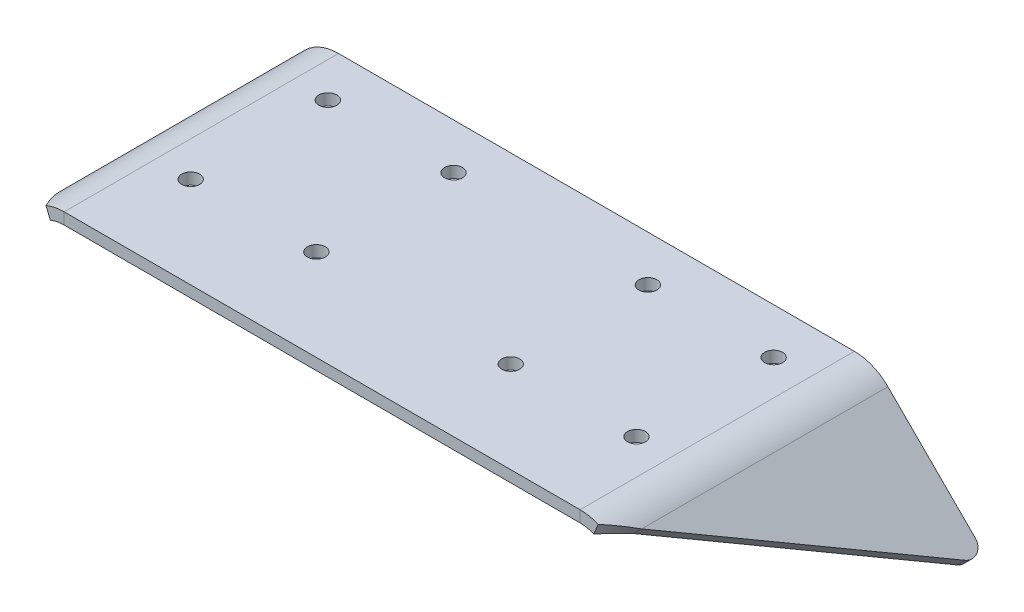
ISO-10303-21;
HEADER;
FILE_DESCRIPTION(('STEP AP214'),'2;1');
FILE_NAME('part.step','',(''),(''),'','','');
FILE_SCHEMA(('AUTOMOTIVE_DESIGN { 1 0 10303 214 1 1 1 1 }'));
ENDSEC;
DATA;
#1=APPLICATION_CONTEXT('core data for automotive mechanical design processes');
#2=APPLICATION_PROTOCOL_DEFINITION('international standard','automotive_design',2000,#1);
#3=PRODUCT_CONTEXT('',#1,'mechanical');
#4=PRODUCT('Part','Part','',(#3));
#5=PRODUCT_RELATED_PRODUCT_CATEGORY('part','',(#4));
#6=PRODUCT_DEFINITION_FORMATION('','',#4);
#7=PRODUCT_DEFINITION_CONTEXT('part definition',#1,'design');
#8=PRODUCT_DEFINITION('design','',#6,#7);
#9=PRODUCT_DEFINITION_SHAPE('','',#8);
#10=(LENGTH_UNIT() NAMED_UNIT(*) SI_UNIT(.MILLI.,.METRE.));
#11=(NAMED_UNIT(*) PLANE_ANGLE_UNIT() SI_UNIT($,.RADIAN.));
#12=(NAMED_UNIT(*) SI_UNIT($,.STERADIAN.) SOLID_ANGLE_UNIT());
#13=UNCERTAINTY_MEASURE_WITH_UNIT(LENGTH_MEASURE(1.E-05),#10,'distance_accuracy_value','');
#14=(GEOMETRIC_REPRESENTATION_CONTEXT(3) GLOBAL_UNCERTAINTY_ASSIGNED_CONTEXT((#13)) GLOBAL_UNIT_ASSIGNED_CONTEXT((#10,
#11,#12)) REPRESENTATION_CONTEXT('',''));
#15=CARTESIAN_POINT('',(0.,0.,0.));
#16=DIRECTION('',(0.,0.,1.));
#17=DIRECTION('',(1.,0.,0.));
#18=AXIS2_PLACEMENT_3D('',#15,#16,#17);
#19=CARTESIAN_POINT('',(0.,-0.635,0.));
#20=DIRECTION('',(0.,1.,0.));
#21=DIRECTION('',(0.,0.,1.));
#22=AXIS2_PLACEMENT_3D('',#19,#20,#21);
#23=PLANE('',#22);
#24=CARTESIAN_POINT('',(-61.9125,-0.634999999999998,-25.4));
#25=DIRECTION('',(0.,1.,0.));
#26=DIRECTION('',(0.,0.,1.));
#27=AXIS2_PLACEMENT_3D('',#24,#25,#26);
#28=CIRCLE('',#27,2.48919999999999);
#29=CARTESIAN_POINT('',(-61.9125,-0.634999999999998,-22.9108));
#30=VERTEX_POINT('',#29);
#31=EDGE_CURVE('E492',#30,#30,#28,.T.);
#32=ORIENTED_EDGE('',*,*,#31,.T.);
#33=EDGE_LOOP('',(#32));
#34=FACE_BOUND('',#33,.T.);
#35=CARTESIAN_POINT('',(-61.9125,-0.634999999999998,12.7));
#36=DIRECTION('',(0.,1.,0.));
#37=DIRECTION('',(0.,0.,1.));
#38=AXIS2_PLACEMENT_3D('',#35,#36,#37);
#39=CIRCLE('',#38,2.48919999999999);
#40=CARTESIAN_POINT('',(-61.9125,-0.634999999999998,15.1892));
#41=VERTEX_POINT('',#40);
#42=EDGE_CURVE('E496',#41,#41,#39,.T.);
#43=ORIENTED_EDGE('',*,*,#42,.T.);
#44=EDGE_LOOP('',(#43));
#45=FACE_BOUND('',#44,.T.);
#46=CARTESIAN_POINT('',(61.9125,-0.634999999999998,12.7));
#47=DIRECTION('',(0.,1.,0.));
#48=DIRECTION('',(0.,0.,1.));
#49=AXIS2_PLACEMENT_3D('',#46,#47,#48);
#50=CIRCLE('',#49,2.48919999999998);
#51=CARTESIAN_POINT('',(61.9125,-0.634999999999998,15.1892));
#52=VERTEX_POINT('',#51);
#53=EDGE_CURVE('E500',#52,#52,#50,.T.);
#54=ORIENTED_EDGE('',*,*,#53,.T.);
#55=EDGE_LOOP('',(#54));
#56=FACE_BOUND('',#55,.T.);
#57=CARTESIAN_POINT('',(61.9125,-0.634999999999998,-25.4));
#58=DIRECTION('',(0.,1.,0.));
#59=DIRECTION('',(0.,0.,1.));
#60=AXIS2_PLACEMENT_3D('',#57,#58,#59);
#61=CIRCLE('',#60,2.48919999999998);
#62=CARTESIAN_POINT('',(61.9125,-0.634999999999998,-22.9108));
#63=VERTEX_POINT('',#62);
#64=EDGE_CURVE('E504',#63,#63,#61,.T.);
#65=ORIENTED_EDGE('',*,*,#64,.T.);
#66=EDGE_LOOP('',(#65));
#67=FACE_BOUND('',#66,.T.);
#68=CARTESIAN_POINT('',(-26.9875,-0.634999999999998,-25.4));
#69=DIRECTION('',(0.,1.,0.));
#70=DIRECTION('',(0.,0.,1.));
#71=AXIS2_PLACEMENT_3D('',#68,#69,#70);
#72=CIRCLE('',#71,2.48919999999999);
#73=CARTESIAN_POINT('',(-26.9875,-0.634999999999998,-22.9108));
#74=VERTEX_POINT('',#73);
#75=EDGE_CURVE('E508',#74,#74,#72,.T.);
#76=ORIENTED_EDGE('',*,*,#75,.T.);
#77=EDGE_LOOP('',(#76));
#78=FACE_BOUND('',#77,.T.);
#79=CARTESIAN_POINT('',(-26.9875,-0.634999999999998,12.7));
#80=DIRECTION('',(0.,1.,0.));
#81=DIRECTION('',(0.,0.,1.));
#82=AXIS2_PLACEMENT_3D('',#79,#80,#81);
#83=CIRCLE('',#82,2.48919999999999);
#84=CARTESIAN_POINT('',(-26.9875,-0.634999999999998,15.1892));
#85=VERTEX_POINT('',#84);
#86=EDGE_CURVE('E512',#85,#85,#83,.T.);
#87=ORIENTED_EDGE('',*,*,#86,.T.);
#88=EDGE_LOOP('',(#87));
#89=FACE_BOUND('',#88,.T.);
#90=CARTESIAN_POINT('',(26.9875,-0.634999999999998,12.7));
#91=DIRECTION('',(0.,1.,0.));
#92=DIRECTION('',(0.,0.,1.));
#93=AXIS2_PLACEMENT_3D('',#90,#91,#92);
#94=CIRCLE('',#93,2.48919999999999);
#95=CARTESIAN_POINT('',(26.9875,-0.634999999999998,15.1892));
#96=VERTEX_POINT('',#95);
#97=EDGE_CURVE('E516',#96,#96,#94,.T.);
#98=ORIENTED_EDGE('',*,*,#97,.T.);
#99=EDGE_LOOP('',(#98));
#100=FACE_BOUND('',#99,.T.);
#101=CARTESIAN_POINT('',(26.9875,-0.634999999999998,-25.4));
#102=DIRECTION('',(0.,1.,0.));
#103=DIRECTION('',(0.,0.,1.));
#104=AXIS2_PLACEMENT_3D('',#101,#102,#103);
#105=CIRCLE('',#104,2.48919999999999);
#106=CARTESIAN_POINT('',(26.9875,-0.634999999999998,-22.9108));
#107=VERTEX_POINT('',#106);
#108=EDGE_CURVE('E519',#107,#107,#105,.T.);
#109=ORIENTED_EDGE('',*,*,#108,.T.);
#110=EDGE_LOOP('',(#109));
#111=FACE_BOUND('',#110,.T.);
#112=DIRECTION('',(1.,0.,0.));
#113=VECTOR('',#112,1.);
#114=CARTESIAN_POINT('',(0.,-0.635,-38.1000000000001));
#115=LINE('',#114,#113);
#116=CARTESIAN_POINT('',(71.649599390816,-0.635,-38.1000000000001));
#117=VERTEX_POINT('',#116);
#118=CARTESIAN_POINT('',(-71.649599390816,-0.635000000000002,-38.1000000000001));
#119=VERTEX_POINT('',#118);
#120=EDGE_CURVE('E78',#117,#119,#115,.F.);
#121=ORIENTED_EDGE('',*,*,#120,.F.);
#122=DIRECTION('',(0.,0.,1.));
#123=VECTOR('',#122,1.);
#124=CARTESIAN_POINT('',(71.649599390816,-0.635,0.));
#125=LINE('',#124,#123);
#126=CARTESIAN_POINT('',(71.649599390816,-0.635,38.1));
#127=VERTEX_POINT('',#126);
#128=EDGE_CURVE('E70',#117,#127,#125,.T.);
#129=ORIENTED_EDGE('',*,*,#128,.T.);
#130=DIRECTION('',(1.,0.,0.));
#131=VECTOR('',#130,1.);
#132=CARTESIAN_POINT('',(0.,-0.635,38.1));
#133=LINE('',#132,#131);
#134=CARTESIAN_POINT('',(-71.649599390816,-0.635,38.1));
#135=VERTEX_POINT('',#134);
#136=EDGE_CURVE('E86',#135,#127,#133,.T.);
#137=ORIENTED_EDGE('',*,*,#136,.F.);
#138=DIRECTION('',(0.,0.,1.));
#139=VECTOR('',#138,1.);
#140=CARTESIAN_POINT('',(-71.649599390816,-0.635,0.));
#141=LINE('',#140,#139);
#142=EDGE_CURVE('E533',#119,#135,#141,.T.);
#143=ORIENTED_EDGE('',*,*,#142,.F.);
#144=EDGE_LOOP('',(#121,#129,#137,#143));
#145=FACE_BOUND('',#144,.T.);
#146=ADVANCED_FACE('F61',(#34,#45,#56,#67,#78,#89,#100,#111,#145),#23,.F.);
#147=CARTESIAN_POINT('',(0.,2.54,38.1));
#148=DIRECTION('',(0.,0.,1.));
#149=DIRECTION('',(1.,0.,0.));
#150=AXIS2_PLACEMENT_3D('',#147,#148,#149);
#151=PLANE('',#150);
#152=DIRECTION('',(0.,-1.,0.));
#153=VECTOR('',#152,1.);
#154=CARTESIAN_POINT('',(71.649599390816,2.54,38.1));
#155=LINE('',#154,#153);
#156=CARTESIAN_POINT('',(71.649599390816,2.54,38.1));
#157=VERTEX_POINT('',#156);
#158=EDGE_CURVE('E569',#157,#127,#155,.T.);
#159=ORIENTED_EDGE('',*,*,#158,.F.);
#160=DIRECTION('',(1.,0.,0.));
#161=VECTOR('',#160,1.);
#162=CARTESIAN_POINT('',(0.,2.54,38.1));
#163=LINE('',#162,#161);
#164=CARTESIAN_POINT('',(-71.649599390816,2.54,38.0999999999999));
#165=VERTEX_POINT('',#164);
#166=EDGE_CURVE('E530',#165,#157,#163,.T.);
#167=ORIENTED_EDGE('',*,*,#166,.F.);
#168=DIRECTION('',(0.,-1.,0.));
#169=VECTOR('',#168,1.);
#170=CARTESIAN_POINT('',(-71.649599390816,2.54,38.1));
#171=LINE('',#170,#169);
#172=EDGE_CURVE('E536',#165,#135,#171,.T.);
#173=ORIENTED_EDGE('',*,*,#172,.T.);
#174=ORIENTED_EDGE('',*,*,#136,.T.);
#175=EDGE_LOOP('',(#159,#167,#173,#174));
#176=FACE_BOUND('',#175,.T.);
#177=ADVANCED_FACE('F480',(#176),#151,.T.);
#178=CARTESIAN_POINT('',(0.,2.54,-38.1));
#179=DIRECTION('',(0.,0.,-1.));
#180=DIRECTION('',(-1.,0.,0.));
#181=AXIS2_PLACEMENT_3D('',#178,#179,#180);
#182=PLANE('',#181);
#183=DIRECTION('',(0.,1.,0.));
#184=VECTOR('',#183,1.);
#185=CARTESIAN_POINT('',(71.649599390816,2.54,-38.1000000000001));
#186=LINE('',#185,#184);
#187=CARTESIAN_POINT('',(71.649599390816,2.54,-38.1000000000001));
#188=VERTEX_POINT('',#187);
#189=EDGE_CURVE('E12',#117,#188,#186,.T.);
#190=ORIENTED_EDGE('',*,*,#189,.F.);
#191=ORIENTED_EDGE('',*,*,#120,.T.);
#192=DIRECTION('',(0.,1.,0.));
#193=VECTOR('',#192,1.);
#194=CARTESIAN_POINT('',(-71.649599390816,2.54,-38.1));
#195=LINE('',#194,#193);
#196=CARTESIAN_POINT('',(-71.649599390816,2.54,-38.1));
#197=VERTEX_POINT('',#196);
#198=EDGE_CURVE('E529',#119,#197,#195,.T.);
#199=ORIENTED_EDGE('',*,*,#198,.T.);
#200=DIRECTION('',(-1.,0.,0.));
#201=VECTOR('',#200,1.);
#202=CARTESIAN_POINT('',(0.,2.54,-38.1));
#203=LINE('',#202,#201);
#204=EDGE_CURVE('E574',#188,#197,#203,.T.);
#205=ORIENTED_EDGE('',*,*,#204,.F.);
#206=EDGE_LOOP('',(#190,#191,#199,#205));
#207=FACE_BOUND('',#206,.T.);
#208=ADVANCED_FACE('F63',(#207),#182,.T.);
#209=CARTESIAN_POINT('',(0.,2.54,0.));
#210=DIRECTION('',(0.,1.,0.));
#211=DIRECTION('',(0.,0.,1.));
#212=AXIS2_PLACEMENT_3D('',#209,#210,#211);
#213=PLANE('',#212);
#214=DIRECTION('',(0.,0.,1.));
#215=VECTOR('',#214,1.);
#216=CARTESIAN_POINT('',(71.649599390816,2.54,0.));
#217=LINE('',#216,#215);
#218=EDGE_CURVE('E538',#188,#157,#217,.T.);
#219=ORIENTED_EDGE('',*,*,#218,.F.);
#220=ORIENTED_EDGE('',*,*,#204,.T.);
#221=DIRECTION('',(0.,0.,1.));
#222=VECTOR('',#221,1.);
#223=CARTESIAN_POINT('',(-71.649599390816,2.54,0.));
#224=LINE('',#223,#222);
#225=EDGE_CURVE('E526',#197,#165,#224,.T.);
#226=ORIENTED_EDGE('',*,*,#225,.T.);
#227=ORIENTED_EDGE('',*,*,#166,.T.);
#228=EDGE_LOOP('',(#219,#220,#226,#227));
#229=FACE_BOUND('',#228,.T.);
#230=CARTESIAN_POINT('',(-61.9125,2.54,-25.4));
#231=DIRECTION('',(0.,1.,0.));
#232=DIRECTION('',(0.,0.,1.));
#233=AXIS2_PLACEMENT_3D('',#230,#231,#232);
#234=CIRCLE('',#233,2.48919999999999);
#235=CARTESIAN_POINT('',(-61.9125,2.54,-22.9108));
#236=VERTEX_POINT('',#235);
#237=EDGE_CURVE('E436',#236,#236,#234,.T.);
#238=ORIENTED_EDGE('',*,*,#237,.F.);
#239=EDGE_LOOP('',(#238));
#240=FACE_BOUND('',#239,.T.);
#241=CARTESIAN_POINT('',(-61.9125,2.54,12.7));
#242=DIRECTION('',(0.,1.,0.));
#243=DIRECTION('',(0.,0.,1.));
#244=AXIS2_PLACEMENT_3D('',#241,#242,#243);
#245=CIRCLE('',#244,2.48919999999999);
#246=CARTESIAN_POINT('',(-61.9125,2.54,15.1892));
#247=VERTEX_POINT('',#246);
#248=EDGE_CURVE('E972',#247,#247,#245,.T.);
#249=ORIENTED_EDGE('',*,*,#248,.F.);
#250=EDGE_LOOP('',(#249));
#251=FACE_BOUND('',#250,.T.);
#252=CARTESIAN_POINT('',(61.9125,2.54,12.7));
#253=DIRECTION('',(0.,1.,0.));
#254=DIRECTION('',(0.,0.,1.));
#255=AXIS2_PLACEMENT_3D('',#252,#253,#254);
#256=CIRCLE('',#255,2.48919999999998);
#257=CARTESIAN_POINT('',(61.9125,2.54,15.1892));
#258=VERTEX_POINT('',#257);
#259=EDGE_CURVE('E970',#258,#258,#256,.T.);
#260=ORIENTED_EDGE('',*,*,#259,.F.);
#261=EDGE_LOOP('',(#260));
#262=FACE_BOUND('',#261,.T.);
#263=CARTESIAN_POINT('',(61.9125,2.54,-25.4));
#264=DIRECTION('',(0.,1.,0.));
#265=DIRECTION('',(0.,0.,1.));
#266=AXIS2_PLACEMENT_3D('',#263,#264,#265);
#267=CIRCLE('',#266,2.48919999999998);
#268=CARTESIAN_POINT('',(61.9125,2.54,-22.9108));
#269=VERTEX_POINT('',#268);
#270=EDGE_CURVE('E967',#269,#269,#267,.T.);
#271=ORIENTED_EDGE('',*,*,#270,.F.);
#272=EDGE_LOOP('',(#271));
#273=FACE_BOUND('',#272,.T.);
#274=CARTESIAN_POINT('',(-26.9875,2.54,-25.4));
#275=DIRECTION('',(0.,1.,0.));
#276=DIRECTION('',(0.,0.,1.));
#277=AXIS2_PLACEMENT_3D('',#274,#275,#276);
#278=CIRCLE('',#277,2.48919999999999);
#279=CARTESIAN_POINT('',(-26.9875,2.54,-22.9108));
#280=VERTEX_POINT('',#279);
#281=EDGE_CURVE('E964',#280,#280,#278,.T.);
#282=ORIENTED_EDGE('',*,*,#281,.F.);
#283=EDGE_LOOP('',(#282));
#284=FACE_BOUND('',#283,.T.);
#285=CARTESIAN_POINT('',(-26.9875,2.54,12.7));
#286=DIRECTION('',(0.,1.,0.));
#287=DIRECTION('',(0.,0.,1.));
#288=AXIS2_PLACEMENT_3D('',#285,#286,#287);
#289=CIRCLE('',#288,2.48919999999999);
#290=CARTESIAN_POINT('',(-26.9875,2.54,15.1892));
#291=VERTEX_POINT('',#290);
#292=EDGE_CURVE('E961',#291,#291,#289,.T.);
#293=ORIENTED_EDGE('',*,*,#292,.F.);
#294=EDGE_LOOP('',(#293));
#295=FACE_BOUND('',#294,.T.);
#296=CARTESIAN_POINT('',(26.9875,2.54,12.7));
#297=DIRECTION('',(0.,1.,0.));
#298=DIRECTION('',(0.,0.,1.));
#299=AXIS2_PLACEMENT_3D('',#296,#297,#298);
#300=CIRCLE('',#299,2.48919999999999);
#301=CARTESIAN_POINT('',(26.9875,2.54,15.1892));
#302=VERTEX_POINT('',#301);
#303=EDGE_CURVE('E958',#302,#302,#300,.T.);
#304=ORIENTED_EDGE('',*,*,#303,.F.);
#305=EDGE_LOOP('',(#304));
#306=FACE_BOUND('',#305,.T.);
#307=CARTESIAN_POINT('',(26.9875,2.54,-25.4));
#308=DIRECTION('',(0.,1.,0.));
#309=DIRECTION('',(0.,0.,1.));
#310=AXIS2_PLACEMENT_3D('',#307,#308,#309);
#311=CIRCLE('',#310,2.48919999999999);
#312=CARTESIAN_POINT('',(26.9875,2.54,-22.9108));
#313=VERTEX_POINT('',#312);
#314=EDGE_CURVE('E578',#313,#313,#311,.T.);
#315=ORIENTED_EDGE('',*,*,#314,.F.);
#316=EDGE_LOOP('',(#315));
#317=FACE_BOUND('',#316,.T.);
#318=ADVANCED_FACE('F451',(#229,#240,#251,#262,#273,#284,#295,#306,#317),#213,.T.);
#319=CARTESIAN_POINT('',(-61.9125,2.54,-25.4));
#320=DIRECTION('',(0.,1.,0.));
#321=DIRECTION('',(0.,0.,1.));
#322=AXIS2_PLACEMENT_3D('',#319,#320,#321);
#323=CYLINDRICAL_SURFACE('',#322,2.48919999999999);
#324=ORIENTED_EDGE('',*,*,#237,.T.);
#325=EDGE_LOOP('',(#324));
#326=FACE_BOUND('',#325,.T.);
#327=ORIENTED_EDGE('',*,*,#31,.F.);
#328=EDGE_LOOP('',(#327));
#329=FACE_BOUND('',#328,.T.);
#330=ADVANCED_FACE('F447',(#326,#329),#323,.F.);
#331=CARTESIAN_POINT('',(-61.9125,2.54,12.7));
#332=DIRECTION('',(0.,1.,0.));
#333=DIRECTION('',(0.,0.,1.));
#334=AXIS2_PLACEMENT_3D('',#331,#332,#333);
#335=CYLINDRICAL_SURFACE('',#334,2.48919999999999);
#336=ORIENTED_EDGE('',*,*,#248,.T.);
#337=EDGE_LOOP('',(#336));
#338=FACE_BOUND('',#337,.T.);
#339=ORIENTED_EDGE('',*,*,#42,.F.);
#340=EDGE_LOOP('',(#339));
#341=FACE_BOUND('',#340,.T.);
#342=ADVANCED_FACE('F450',(#338,#341),#335,.F.);
#343=CARTESIAN_POINT('',(61.9125,2.54,12.7));
#344=DIRECTION('',(0.,1.,0.));
#345=DIRECTION('',(0.,0.,1.));
#346=AXIS2_PLACEMENT_3D('',#343,#344,#345);
#347=CYLINDRICAL_SURFACE('',#346,2.48919999999998);
#348=ORIENTED_EDGE('',*,*,#259,.T.);
#349=EDGE_LOOP('',(#348));
#350=FACE_BOUND('',#349,.T.);
#351=ORIENTED_EDGE('',*,*,#53,.F.);
#352=EDGE_LOOP('',(#351));
#353=FACE_BOUND('',#352,.T.);
#354=ADVANCED_FACE('F455',(#350,#353),#347,.F.);
#355=CARTESIAN_POINT('',(61.9125,2.54,-25.4));
#356=DIRECTION('',(0.,1.,0.));
#357=DIRECTION('',(0.,0.,1.));
#358=AXIS2_PLACEMENT_3D('',#355,#356,#357);
#359=CYLINDRICAL_SURFACE('',#358,2.48919999999998);
#360=ORIENTED_EDGE('',*,*,#270,.T.);
#361=EDGE_LOOP('',(#360));
#362=FACE_BOUND('',#361,.T.);
#363=ORIENTED_EDGE('',*,*,#64,.F.);
#364=EDGE_LOOP('',(#363));
#365=FACE_BOUND('',#364,.T.);
#366=ADVANCED_FACE('F459',(#362,#365),#359,.F.);
#367=CARTESIAN_POINT('',(-26.9875,2.54,-25.4));
#368=DIRECTION('',(0.,1.,0.));
#369=DIRECTION('',(0.,0.,1.));
#370=AXIS2_PLACEMENT_3D('',#367,#368,#369);
#371=CYLINDRICAL_SURFACE('',#370,2.48919999999999);
#372=ORIENTED_EDGE('',*,*,#281,.T.);
#373=EDGE_LOOP('',(#372));
#374=FACE_BOUND('',#373,.T.);
#375=ORIENTED_EDGE('',*,*,#75,.F.);
#376=EDGE_LOOP('',(#375));
#377=FACE_BOUND('',#376,.T.);
#378=ADVANCED_FACE('F463',(#374,#377),#371,.F.);
#379=CARTESIAN_POINT('',(-26.9875,2.54,12.7));
#380=DIRECTION('',(0.,1.,0.));
#381=DIRECTION('',(0.,0.,1.));
#382=AXIS2_PLACEMENT_3D('',#379,#380,#381);
#383=CYLINDRICAL_SURFACE('',#382,2.48919999999999);
#384=ORIENTED_EDGE('',*,*,#292,.T.);
#385=EDGE_LOOP('',(#384));
#386=FACE_BOUND('',#385,.T.);
#387=ORIENTED_EDGE('',*,*,#86,.F.);
#388=EDGE_LOOP('',(#387));
#389=FACE_BOUND('',#388,.T.);
#390=ADVANCED_FACE('F467',(#386,#389),#383,.F.);
#391=CARTESIAN_POINT('',(26.9875,2.54,12.7));
#392=DIRECTION('',(0.,1.,0.));
#393=DIRECTION('',(0.,0.,1.));
#394=AXIS2_PLACEMENT_3D('',#391,#392,#393);
#395=CYLINDRICAL_SURFACE('',#394,2.48919999999999);
#396=ORIENTED_EDGE('',*,*,#303,.T.);
#397=EDGE_LOOP('',(#396));
#398=FACE_BOUND('',#397,.T.);
#399=ORIENTED_EDGE('',*,*,#97,.F.);
#400=EDGE_LOOP('',(#399));
#401=FACE_BOUND('',#400,.T.);
#402=ADVANCED_FACE('F471',(#398,#401),#395,.F.);
#403=CARTESIAN_POINT('',(26.9875,2.54,-25.4));
#404=DIRECTION('',(0.,1.,0.));
#405=DIRECTION('',(0.,0.,1.));
#406=AXIS2_PLACEMENT_3D('',#403,#404,#405);
#407=CYLINDRICAL_SURFACE('',#406,2.48919999999999);
#408=ORIENTED_EDGE('',*,*,#314,.T.);
#409=EDGE_LOOP('',(#408));
#410=FACE_BOUND('',#409,.T.);
#411=ORIENTED_EDGE('',*,*,#108,.F.);
#412=EDGE_LOOP('',(#411));
#413=FACE_BOUND('',#412,.T.);
#414=ADVANCED_FACE('F475',(#410,#413),#407,.F.);
#415=CARTESIAN_POINT('',(-71.649599390816,-10.635,-38.1));
#416=DIRECTION('',(0.,0.,-1.));
#417=DIRECTION('',(-1.,0.,0.));
#418=AXIS2_PLACEMENT_3D('',#415,#416,#417);
#419=PLANE('',#418);
#420=ORIENTED_EDGE('',*,*,#198,.F.);
#421=CARTESIAN_POINT('',(-71.649599390816,-10.635,-38.1000000000001));
#422=DIRECTION('',(0.,0.,1.));
#423=DIRECTION('',(1.,0.,0.));
#424=AXIS2_PLACEMENT_3D('',#421,#422,#423);
#425=CIRCLE('',#424,10.);
#426=CARTESIAN_POINT('',(-78.7206672026815,-3.56393218813454,-38.1000000000001));
#427=VERTEX_POINT('',#426);
#428=EDGE_CURVE('E343',#119,#427,#425,.T.);
#429=ORIENTED_EDGE('',*,*,#428,.T.);
#430=DIRECTION('',(-0.707106781186549,0.707106781186546,0.));
#431=VECTOR('',#430,1.);
#432=CARTESIAN_POINT('',(-80.9657312329488,-1.31886815786725,-38.1));
#433=LINE('',#432,#431);
#434=CARTESIAN_POINT('',(-80.9657312329488,-1.31886815786725,-38.1));
#435=VERTEX_POINT('',#434);
#436=EDGE_CURVE('E330',#427,#435,#433,.T.);
#437=ORIENTED_EDGE('',*,*,#436,.T.);
#438=CARTESIAN_POINT('',(-71.649599390816,-10.635,-38.1));
#439=DIRECTION('',(0.,0.,1.));
#440=DIRECTION('',(1.,0.,0.));
#441=AXIS2_PLACEMENT_3D('',#438,#439,#440);
#442=CIRCLE('',#441,13.175);
#443=EDGE_CURVE('E334',#197,#435,#442,.T.);
#444=ORIENTED_EDGE('',*,*,#443,.F.);
#445=EDGE_LOOP('',(#420,#429,#437,#444));
#446=FACE_BOUND('',#445,.T.);
#447=ADVANCED_FACE('F446',(#446),#419,.T.);
#448=CARTESIAN_POINT('',(-80.9657312329488,-1.31886815786726,30.2993132413988));
#449=CARTESIAN_POINT('',(-79.7460002936354,-0.0991372185538539,32.900079770217));
#450=CARTESIAN_POINT('',(-78.2851088846469,0.876999213252119,35.4992334711818));
#451=CARTESIAN_POINT('',(-76.6914536122261,1.53711284083619,38.0999999999999));
#452=CARTESIAN_POINT('',(-78.7206672026815,-3.56393218813455,30.2993132413988));
#453=CARTESIAN_POINT('',(-77.7949370670991,-2.6382020525521,32.8999060226867));
#454=CARTESIAN_POINT('',(-76.685958425089,-1.89720621405217,35.4994072187121));
#455=CARTESIAN_POINT('',(-75.4764337144669,-1.39620467488714,38.0999999999999));
#456=B_SPLINE_SURFACE_WITH_KNOTS('',1,3,((#448,#449,#450,#451),(#452,#453,#454,#455)),
.UNSPECIFIED.,.F.,.F.,.F.,(2,2),(4,4),(0.,1.),(0.,1.),.UNSPECIFIED.);
#457=CARTESIAN_POINT('',(-80.9657312329488,-1.31886815786726,30.2993132413988));
#458=CARTESIAN_POINT('',(-78.7206672026815,-3.56393218813455,30.2993132413988));
#459=B_SPLINE_CURVE_WITH_KNOTS('',1,(#457,#458),.UNSPECIFIED.,.F.,.F.,(2,2),(0.,1.),.UNSPECIFIED.);
#460=CARTESIAN_POINT('',(-80.9657312329488,-1.31886815786725,30.2993132413989));
#461=VERTEX_POINT('',#460);
#462=CARTESIAN_POINT('',(-78.7206672026815,-3.56393218813454,30.2993132413989));
#463=VERTEX_POINT('',#462);
#464=EDGE_CURVE('E333',#461,#463,#459,.T.);
#465=CARTESIAN_POINT('',(-78.7206672026815,-3.56393218813455,30.2993132413988));
#466=CARTESIAN_POINT('',(-77.7949370670991,-2.6382020525521,32.8999060226867));
#467=CARTESIAN_POINT('',(-76.685958425089,-1.89720621405217,35.4994072187121));
#468=CARTESIAN_POINT('',(-75.4764337144669,-1.39620467488714,38.0999999999999));
#469=B_SPLINE_CURVE_WITH_KNOTS('',3,(#465,#466,#467,#468),.UNSPECIFIED.,.F.,.F.,(4,4),(0.,1.),.UNSPECIFIED.);
#470=CARTESIAN_POINT('',(-75.4764337144669,-1.39620467488714,38.0999999999999));
#471=VERTEX_POINT('',#470);
#472=EDGE_CURVE('E383',#463,#471,#469,.T.);
#473=CARTESIAN_POINT('',(-75.4764337144669,-1.39620467488714,38.0999999999999));
#474=CARTESIAN_POINT('',(-76.6914536122261,1.53711284083619,38.0999999999999));
#475=B_SPLINE_CURVE_WITH_KNOTS('',1,(#473,#474),.UNSPECIFIED.,.F.,.F.,(2,2),(0.,1.),.UNSPECIFIED.);
#476=CARTESIAN_POINT('',(-76.6914536122261,1.53711284083619,38.0999999999999));
#477=VERTEX_POINT('',#476);
#478=EDGE_CURVE('E420',#471,#477,#475,.T.);
#479=CARTESIAN_POINT('',(-76.6914536122261,1.53711284083619,38.0999999999999));
#480=CARTESIAN_POINT('',(-78.2851088846469,0.876999213252119,35.4992334711818));
#481=CARTESIAN_POINT('',(-79.7460002936354,-0.0991372185538539,32.900079770217));
#482=CARTESIAN_POINT('',(-80.9657312329488,-1.31886815786726,30.2993132413988));
#483=B_SPLINE_CURVE_WITH_KNOTS('',3,(#479,#480,#481,#482),.UNSPECIFIED.,.F.,.F.,(4,4),(0.,1.),.UNSPECIFIED.);
#484=EDGE_CURVE('E337',#461,#477,#483,.F.);
#485=ORIENTED_EDGE('',*,*,#464,.T.);
#486=ORIENTED_EDGE('',*,*,#472,.T.);
#487=ORIENTED_EDGE('',*,*,#478,.T.);
#488=ORIENTED_EDGE('',*,*,#484,.F.);
#489=EDGE_LOOP('',(#485,#486,#487,#488));
#490=FACE_BOUND('',#489,.T.);
#491=ADVANCED_FACE('F365',(#490),#456,.T.);
#492=CARTESIAN_POINT('',(-71.649599390816,-10.635,38.1));
#493=DIRECTION('',(0.,0.,1.));
#494=DIRECTION('',(1.,0.,0.));
#495=AXIS2_PLACEMENT_3D('',#492,#493,#494);
#496=PLANE('',#495);
#497=CARTESIAN_POINT('',(-71.649599390816,-10.635,38.0999999999999));
#498=DIRECTION('',(0.,0.,1.));
#499=DIRECTION('',(1.,0.,0.));
#500=AXIS2_PLACEMENT_3D('',#497,#498,#499);
#501=CIRCLE('',#500,10.);
#502=EDGE_CURVE('E338',#471,#135,#501,.F.);
#503=ORIENTED_EDGE('',*,*,#502,.T.);
#504=ORIENTED_EDGE('',*,*,#172,.F.);
#505=CARTESIAN_POINT('',(-71.649599390816,-10.635,38.1));
#506=DIRECTION('',(0.,0.,-1.));
#507=DIRECTION('',(-1.,0.,0.));
#508=AXIS2_PLACEMENT_3D('',#505,#506,#507);
#509=CIRCLE('',#508,13.175);
#510=EDGE_CURVE('E946',#477,#165,#509,.T.);
#511=ORIENTED_EDGE('',*,*,#510,.F.);
#512=ORIENTED_EDGE('',*,*,#478,.F.);
#513=EDGE_LOOP('',(#503,#504,#511,#512));
#514=FACE_BOUND('',#513,.T.);
#515=ADVANCED_FACE('F356',(#514),#496,.T.);
#516=CARTESIAN_POINT('',(-71.649599390816,-10.635,-76.8071950263532));
#517=DIRECTION('',(0.,0.,1.));
#518=DIRECTION('',(1.,0.,0.));
#519=AXIS2_PLACEMENT_3D('',#516,#517,#518);
#520=CYLINDRICAL_SURFACE('',#519,13.175);
#521=ORIENTED_EDGE('',*,*,#484,.T.);
#522=ORIENTED_EDGE('',*,*,#510,.T.);
#523=ORIENTED_EDGE('',*,*,#225,.F.);
#524=ORIENTED_EDGE('',*,*,#443,.T.);
#525=DIRECTION('',(0.,0.,1.));
#526=VECTOR('',#525,1.);
#527=CARTESIAN_POINT('',(-80.9657312329488,-1.31886815786726,0.));
#528=LINE('',#527,#526);
#529=EDGE_CURVE('E543',#435,#461,#528,.T.);
#530=ORIENTED_EDGE('',*,*,#529,.T.);
#531=EDGE_LOOP('',(#521,#522,#523,#524,#530));
#532=FACE_BOUND('',#531,.T.);
#533=ADVANCED_FACE('F345',(#532),#520,.T.);
#534=CARTESIAN_POINT('',(-71.649599390816,-10.635,-76.8071950263532));
#535=DIRECTION('',(0.,0.,1.));
#536=DIRECTION('',(1.,0.,0.));
#537=AXIS2_PLACEMENT_3D('',#534,#535,#536);
#538=CYLINDRICAL_SURFACE('',#537,10.);
#539=ORIENTED_EDGE('',*,*,#472,.F.);
#540=DIRECTION('',(0.,0.,1.));
#541=VECTOR('',#540,1.);
#542=CARTESIAN_POINT('',(-78.7206672026815,-3.56393218813455,0.));
#543=LINE('',#542,#541);
#544=EDGE_CURVE('E316',#427,#463,#543,.T.);
#545=ORIENTED_EDGE('',*,*,#544,.F.);
#546=ORIENTED_EDGE('',*,*,#428,.F.);
#547=ORIENTED_EDGE('',*,*,#142,.T.);
#548=ORIENTED_EDGE('',*,*,#502,.F.);
#549=EDGE_LOOP('',(#539,#545,#546,#547,#548));
#550=FACE_BOUND('',#549,.T.);
#551=ADVANCED_FACE('F355',(#550),#538,.F.);
#552=CARTESIAN_POINT('',(-105.270268986731,-25.6234059116493,-34.925));
#553=DIRECTION('',(-0.707106781186549,0.707106781186546,0.));
#554=DIRECTION('',(0.,0.,1.));
#555=AXIS2_PLACEMENT_3D('',#552,#553,#554);
#556=CYLINDRICAL_SURFACE('',#555,3.175);
#557=DIRECTION('',(-0.707106781186549,0.707106781186546,0.));
#558=VECTOR('',#557,1.);
#559=CARTESIAN_POINT('',(-105.270268986731,-25.6234059116493,-38.1));
#560=LINE('',#559,#558);
#561=CARTESIAN_POINT('',(-103.025204956463,-27.8684699419166,-38.1));
#562=VERTEX_POINT('',#561);
#563=CARTESIAN_POINT('',(-105.270268986731,-25.6234059116493,-38.1));
#564=VERTEX_POINT('',#563);
#565=EDGE_CURVE('E308',#562,#564,#560,.T.);
#566=ORIENTED_EDGE('',*,*,#565,.F.);
#567=CARTESIAN_POINT('',(-103.025204956463,-27.8684699419166,-34.925));
#568=DIRECTION('',(-0.707106781186549,0.707106781186546,0.));
#569=DIRECTION('',(0.,0.,1.));
#570=AXIS2_PLACEMENT_3D('',#567,#568,#569);
#571=CIRCLE('',#570,3.175);
#572=CARTESIAN_POINT('',(-104.964443896974,-29.8077088824275,-33.325209493961));
#573=VERTEX_POINT('',#572);
#574=EDGE_CURVE('E327',#562,#573,#571,.T.);
#575=ORIENTED_EDGE('',*,*,#574,.T.);
#576=DIRECTION('',(-0.707106781186549,0.707106781186546,0.));
#577=VECTOR('',#576,1.);
#578=CARTESIAN_POINT('',(-107.209507927242,-27.5626448521602,-33.325209493961));
#579=LINE('',#578,#577);
#580=CARTESIAN_POINT('',(-107.209507927242,-27.5626448521602,-33.325209493961));
#581=VERTEX_POINT('',#580);
#582=EDGE_CURVE('E325',#573,#581,#579,.T.);
#583=ORIENTED_EDGE('',*,*,#582,.T.);
#584=CARTESIAN_POINT('',(-105.270268986731,-25.6234059116493,-34.925));
#585=DIRECTION('',(-0.707106781186549,0.707106781186546,0.));
#586=DIRECTION('',(0.,0.,1.));
#587=AXIS2_PLACEMENT_3D('',#584,#585,#586);
#588=CIRCLE('',#587,3.175);
#589=EDGE_CURVE('E320',#564,#581,#588,.T.);
#590=ORIENTED_EDGE('',*,*,#589,.F.);
#591=EDGE_LOOP('',(#566,#575,#583,#590));
#592=FACE_BOUND('',#591,.T.);
#593=ADVANCED_FACE('F269',(#592),#556,.T.);
#594=CARTESIAN_POINT('',(-23.8665753786646,55.7802876964172,0.));
#595=DIRECTION('',(-0.707106781186549,0.707106781186546,0.));
#596=DIRECTION('',(0.,0.,1.));
#597=AXIS2_PLACEMENT_3D('',#594,#595,#596);
#598=PLANE('',#597);
#599=ORIENTED_EDGE('',*,*,#529,.F.);
#600=DIRECTION('',(-0.707106781186546,-0.707106781186549,0.));
#601=VECTOR('',#600,1.);
#602=CARTESIAN_POINT('',(-23.8665753786646,55.7802876964171,-38.1));
#603=LINE('',#602,#601);
#604=EDGE_CURVE('E323',#435,#564,#603,.T.);
#605=ORIENTED_EDGE('',*,*,#604,.T.);
#606=ORIENTED_EDGE('',*,*,#589,.T.);
#607=DIRECTION('',(0.3562906189915,0.356290618991502,0.863778900898434));
#608=VECTOR('',#607,1.);
#609=CARTESIAN_POINT('',(-75.7938594776965,3.85300359738507,42.8378238341969));
#610=LINE('',#609,#608);
#611=EDGE_CURVE('E319',#581,#461,#610,.T.);
#612=ORIENTED_EDGE('',*,*,#611,.T.);
#613=EDGE_LOOP('',(#599,#605,#606,#612));
#614=FACE_BOUND('',#613,.T.);
#615=ADVANCED_FACE('F712',(#614),#598,.T.);
#616=CARTESIAN_POINT('',(-23.8665753786646,55.7802876964171,-38.1));
#617=DIRECTION('',(0.,0.,-1.));
#618=DIRECTION('',(-0.707106781186546,-0.707106781186549,0.));
#619=AXIS2_PLACEMENT_3D('',#616,#617,#618);
#620=PLANE('',#619);
#621=ORIENTED_EDGE('',*,*,#436,.F.);
#622=DIRECTION('',(0.707106781186546,0.707106781186549,0.));
#623=VECTOR('',#622,1.);
#624=CARTESIAN_POINT('',(-21.6215113483973,53.5352236661499,-38.1000000000001));
#625=LINE('',#624,#623);
#626=EDGE_CURVE('E317',#427,#562,#625,.F.);
#627=ORIENTED_EDGE('',*,*,#626,.T.);
#628=ORIENTED_EDGE('',*,*,#565,.T.);
#629=ORIENTED_EDGE('',*,*,#604,.F.);
#630=EDGE_LOOP('',(#621,#627,#628,#629));
#631=FACE_BOUND('',#630,.T.);
#632=ADVANCED_FACE('F701',(#631),#620,.T.);
#633=CARTESIAN_POINT('',(-21.6215113483973,53.5352236661499,0.));
#634=DIRECTION('',(-0.707106781186549,0.707106781186546,0.));
#635=DIRECTION('',(0.,0.,1.));
#636=AXIS2_PLACEMENT_3D('',#633,#634,#635);
#637=PLANE('',#636);
#638=ORIENTED_EDGE('',*,*,#626,.F.);
#639=ORIENTED_EDGE('',*,*,#544,.T.);
#640=DIRECTION('',(0.3562906189915,0.356290618991502,0.863778900898434));
#641=VECTOR('',#640,1.);
#642=CARTESIAN_POINT('',(-73.5487954474292,1.60793956711778,42.8378238341969));
#643=LINE('',#642,#641);
#644=EDGE_CURVE('E548',#573,#463,#643,.T.);
#645=ORIENTED_EDGE('',*,*,#644,.F.);
#646=ORIENTED_EDGE('',*,*,#574,.F.);
#647=EDGE_LOOP('',(#638,#639,#645,#646));
#648=FACE_BOUND('',#647,.T.);
#649=ADVANCED_FACE('F693',(#648),#637,.F.);
#650=CARTESIAN_POINT('',(-75.7938594776965,3.85300359738507,42.8378238341969));
#651=DIRECTION('',(-0.610783918271144,-0.610783918271146,0.503871025524086));
#652=DIRECTION('',(0.3562906189915,0.356290618991502,0.863778900898434));
#653=AXIS2_PLACEMENT_3D('',#650,#651,#652);
#654=PLANE('',#653);
#655=ORIENTED_EDGE('',*,*,#464,.F.);
#656=ORIENTED_EDGE('',*,*,#611,.F.);
#657=ORIENTED_EDGE('',*,*,#582,.F.);
#658=ORIENTED_EDGE('',*,*,#644,.T.);
#659=EDGE_LOOP('',(#655,#656,#657,#658));
#660=FACE_BOUND('',#659,.T.);
#661=ADVANCED_FACE('F358',(#660),#654,.T.);
#662=CARTESIAN_POINT('',(71.649599390816,-10.635,-38.1000000000001));
#663=DIRECTION('',(0.,0.,-1.));
#664=DIRECTION('',(-1.,0.,0.));
#665=AXIS2_PLACEMENT_3D('',#662,#663,#664);
#666=PLANE('',#665);
#667=DIRECTION('',(0.707106781186549,0.707106781186546,0.));
#668=VECTOR('',#667,1.);
#669=CARTESIAN_POINT('',(80.9657312329488,-1.31886815786725,-38.1000000000001));
#670=LINE('',#669,#668);
#671=CARTESIAN_POINT('',(78.7206672026815,-3.56393218813454,-38.1000000000001));
#672=VERTEX_POINT('',#671);
#673=CARTESIAN_POINT('',(80.9657312329488,-1.31886815786725,-38.1000000000001));
#674=VERTEX_POINT('',#673);
#675=EDGE_CURVE('E186',#672,#674,#670,.T.);
#676=ORIENTED_EDGE('',*,*,#675,.F.);
#677=CARTESIAN_POINT('',(71.649599390816,-10.635,-38.1000000000001));
#678=DIRECTION('',(0.,0.,-1.));
#679=DIRECTION('',(-1.,0.,0.));
#680=AXIS2_PLACEMENT_3D('',#677,#678,#679);
#681=CIRCLE('',#680,10.);
#682=EDGE_CURVE('E200',#672,#117,#681,.F.);
#683=ORIENTED_EDGE('',*,*,#682,.T.);
#684=ORIENTED_EDGE('',*,*,#189,.T.);
#685=CARTESIAN_POINT('',(71.649599390816,-10.635,-38.1000000000001));
#686=DIRECTION('',(0.,0.,1.));
#687=DIRECTION('',(1.,0.,0.));
#688=AXIS2_PLACEMENT_3D('',#685,#686,#687);
#689=CIRCLE('',#688,13.175);
#690=EDGE_CURVE('E195',#674,#188,#689,.T.);
#691=ORIENTED_EDGE('',*,*,#690,.F.);
#692=EDGE_LOOP('',(#676,#683,#684,#691));
#693=FACE_BOUND('',#692,.T.);
#694=ADVANCED_FACE('F268',(#693),#666,.T.);
#695=CARTESIAN_POINT('',(71.649599390816,-10.635,38.1));
#696=DIRECTION('',(0.,0.,1.));
#697=DIRECTION('',(0.,-1.,0.));
#698=AXIS2_PLACEMENT_3D('',#695,#696,#697);
#699=PLANE('',#698);
#700=ORIENTED_EDGE('',*,*,#158,.T.);
#701=CARTESIAN_POINT('',(71.649599390816,-10.635,38.1));
#702=DIRECTION('',(0.,0.,-1.));
#703=DIRECTION('',(-1.,0.,0.));
#704=AXIS2_PLACEMENT_3D('',#701,#702,#703);
#705=CIRCLE('',#704,10.);
#706=CARTESIAN_POINT('',(75.4764337144669,-1.39620467488714,38.1));
#707=VERTEX_POINT('',#706);
#708=EDGE_CURVE('E203',#127,#707,#705,.T.);
#709=ORIENTED_EDGE('',*,*,#708,.T.);
#710=CARTESIAN_POINT('',(76.6914536122261,1.5371128408362,38.1));
#711=CARTESIAN_POINT('',(75.4764337144669,-1.39620467488713,38.1));
#712=B_SPLINE_CURVE_WITH_KNOTS('',1,(#710,#711),.UNSPECIFIED.,.F.,.F.,(2,2),(0.,1.),.UNSPECIFIED.);
#713=CARTESIAN_POINT('',(76.6914536122261,1.5371128408362,38.1));
#714=VERTEX_POINT('',#713);
#715=EDGE_CURVE('E295',#707,#714,#712,.F.);
#716=ORIENTED_EDGE('',*,*,#715,.T.);
#717=CARTESIAN_POINT('',(71.649599390816,-10.635,38.1));
#718=DIRECTION('',(0.,0.,-1.));
#719=DIRECTION('',(0.,1.,0.));
#720=AXIS2_PLACEMENT_3D('',#717,#718,#719);
#721=CIRCLE('',#720,13.175);
#722=EDGE_CURVE('E198',#157,#714,#721,.T.);
#723=ORIENTED_EDGE('',*,*,#722,.F.);
#724=EDGE_LOOP('',(#700,#709,#716,#723));
#725=FACE_BOUND('',#724,.T.);
#726=ADVANCED_FACE('F228',(#725),#699,.T.);
#727=CARTESIAN_POINT('',(76.6914536122261,1.5371128408362,38.1));
#728=CARTESIAN_POINT('',(78.2851088846469,0.876999213252123,35.4992334711819));
#729=CARTESIAN_POINT('',(79.7460002936354,-0.0991372185538389,32.900079770217));
#730=CARTESIAN_POINT('',(80.9657312329488,-1.31886815786725,30.2993132413989));
#731=CARTESIAN_POINT('',(75.4764337144669,-1.39620467488713,38.1));
#732=CARTESIAN_POINT('',(76.6859584250889,-1.89720621405216,35.4994072187122));
#733=CARTESIAN_POINT('',(77.7949370670991,-2.6382020525521,32.8999060226867));
#734=CARTESIAN_POINT('',(78.7206672026815,-3.56393218813454,30.2993132413989));
#735=B_SPLINE_SURFACE_WITH_KNOTS('',1,3,((#727,#728,#729,#730),(#731,#732,#733,#734)),
.UNSPECIFIED.,.F.,.F.,.F.,(2,2),(4,4),(0.,1.),(0.,1.),.UNSPECIFIED.);
#736=CARTESIAN_POINT('',(75.4764337144669,-1.39620467488713,38.1));
#737=CARTESIAN_POINT('',(76.6859584250889,-1.89720621405216,35.4994072187122));
#738=CARTESIAN_POINT('',(77.7949370670991,-2.6382020525521,32.8999060226867));
#739=CARTESIAN_POINT('',(78.7206672026815,-3.56393218813454,30.2993132413989));
#740=B_SPLINE_CURVE_WITH_KNOTS('',3,(#736,#737,#738,#739),.UNSPECIFIED.,.F.,.F.,(4,4),(0.,1.),.UNSPECIFIED.);
#741=CARTESIAN_POINT('',(78.7206672026815,-3.56393218813454,30.2993132413989));
#742=VERTEX_POINT('',#741);
#743=EDGE_CURVE('E199',#707,#742,#740,.T.);
#744=CARTESIAN_POINT('',(78.7206672026815,-3.56393218813454,30.2993132413989));
#745=CARTESIAN_POINT('',(80.9657312329488,-1.31886815786725,30.2993132413989));
#746=B_SPLINE_CURVE_WITH_KNOTS('',1,(#744,#745),.UNSPECIFIED.,.F.,.F.,(2,2),(0.,1.),.UNSPECIFIED.);
#747=CARTESIAN_POINT('',(80.9657312329488,-1.31886815786725,30.2993132413989));
#748=VERTEX_POINT('',#747);
#749=EDGE_CURVE('E587',#748,#742,#746,.F.);
#750=CARTESIAN_POINT('',(80.9657312329488,-1.31886815786725,30.2993132413989));
#751=CARTESIAN_POINT('',(79.7460002936354,-0.0991372185538389,32.900079770217));
#752=CARTESIAN_POINT('',(78.2851088846469,0.876999213252123,35.4992334711819));
#753=CARTESIAN_POINT('',(76.6914536122261,1.5371128408362,38.1));
#754=B_SPLINE_CURVE_WITH_KNOTS('',3,(#750,#751,#752,#753),.UNSPECIFIED.,.F.,.F.,(4,4),(0.,1.),.UNSPECIFIED.);
#755=EDGE_CURVE('E251',#714,#748,#754,.F.);
#756=ORIENTED_EDGE('',*,*,#743,.T.);
#757=ORIENTED_EDGE('',*,*,#749,.F.);
#758=ORIENTED_EDGE('',*,*,#755,.F.);
#759=ORIENTED_EDGE('',*,*,#715,.F.);
#760=EDGE_LOOP('',(#756,#757,#758,#759));
#761=FACE_BOUND('',#760,.T.);
#762=ADVANCED_FACE('F221',(#761),#735,.T.);
#763=CARTESIAN_POINT('',(71.649599390816,-10.635,76.8071950263532));
#764=DIRECTION('',(0.,0.,-1.));
#765=DIRECTION('',(-1.,0.,0.));
#766=AXIS2_PLACEMENT_3D('',#763,#764,#765);
#767=CYLINDRICAL_SURFACE('',#766,13.175);
#768=ORIENTED_EDGE('',*,*,#722,.T.);
#769=ORIENTED_EDGE('',*,*,#755,.T.);
#770=DIRECTION('',(0.,0.,1.));
#771=VECTOR('',#770,1.);
#772=CARTESIAN_POINT('',(80.9657312329488,-1.31886815786725,0.));
#773=LINE('',#772,#771);
#774=EDGE_CURVE('E579',#674,#748,#773,.T.);
#775=ORIENTED_EDGE('',*,*,#774,.F.);
#776=ORIENTED_EDGE('',*,*,#690,.T.);
#777=ORIENTED_EDGE('',*,*,#218,.T.);
#778=EDGE_LOOP('',(#768,#769,#775,#776,#777));
#779=FACE_BOUND('',#778,.T.);
#780=ADVANCED_FACE('F210',(#779),#767,.T.);
#781=CARTESIAN_POINT('',(71.649599390816,-10.635,76.8071950263532));
#782=DIRECTION('',(0.,0.,-1.));
#783=DIRECTION('',(-1.,0.,0.));
#784=AXIS2_PLACEMENT_3D('',#781,#782,#783);
#785=CYLINDRICAL_SURFACE('',#784,10.);
#786=ORIENTED_EDGE('',*,*,#708,.F.);
#787=ORIENTED_EDGE('',*,*,#128,.F.);
#788=ORIENTED_EDGE('',*,*,#682,.F.);
#789=DIRECTION('',(0.,0.,1.));
#790=VECTOR('',#789,1.);
#791=CARTESIAN_POINT('',(78.7206672026815,-3.56393218813454,0.));
#792=LINE('',#791,#790);
#793=EDGE_CURVE('E184',#672,#742,#792,.T.);
#794=ORIENTED_EDGE('',*,*,#793,.T.);
#795=ORIENTED_EDGE('',*,*,#743,.F.);
#796=EDGE_LOOP('',(#786,#787,#788,#794,#795));
#797=FACE_BOUND('',#796,.T.);
#798=ADVANCED_FACE('F220',(#797),#785,.F.);
#799=CARTESIAN_POINT('',(105.270268986731,-25.6234059116493,-34.9250000000001));
#800=DIRECTION('',(0.707106781186549,0.707106781186546,0.));
#801=DIRECTION('',(0.,0.,1.));
#802=AXIS2_PLACEMENT_3D('',#799,#800,#801);
#803=CYLINDRICAL_SURFACE('',#802,3.175);
#804=CARTESIAN_POINT('',(103.025204956463,-27.8684699419166,-34.9250000000001));
#805=DIRECTION('',(0.707106781186549,0.707106781186546,0.));
#806=DIRECTION('',(0.,0.,1.));
#807=AXIS2_PLACEMENT_3D('',#804,#805,#806);
#808=CIRCLE('',#807,3.175);
#809=CARTESIAN_POINT('',(104.964443896974,-29.8077088824275,-33.3252094939611));
#810=VERTEX_POINT('',#809);
#811=CARTESIAN_POINT('',(103.025204956463,-27.8684699419166,-38.1000000000001));
#812=VERTEX_POINT('',#811);
#813=EDGE_CURVE('E177',#810,#812,#808,.T.);
#814=ORIENTED_EDGE('',*,*,#813,.T.);
#815=DIRECTION('',(0.707106781186549,0.707106781186546,0.));
#816=VECTOR('',#815,1.);
#817=CARTESIAN_POINT('',(105.270268986731,-25.6234059116493,-38.1000000000001));
#818=LINE('',#817,#816);
#819=CARTESIAN_POINT('',(105.270268986731,-25.6234059116493,-38.1000000000001));
#820=VERTEX_POINT('',#819);
#821=EDGE_CURVE('E166',#812,#820,#818,.T.);
#822=ORIENTED_EDGE('',*,*,#821,.T.);
#823=CARTESIAN_POINT('',(105.270268986731,-25.6234059116493,-34.9250000000001));
#824=DIRECTION('',(0.707106781186549,0.707106781186546,0.));
#825=DIRECTION('',(0.,0.,1.));
#826=AXIS2_PLACEMENT_3D('',#823,#824,#825);
#827=CIRCLE('',#826,3.175);
#828=CARTESIAN_POINT('',(107.209507927242,-27.5626448521602,-33.3252094939611));
#829=VERTEX_POINT('',#828);
#830=EDGE_CURVE('E581',#829,#820,#827,.T.);
#831=ORIENTED_EDGE('',*,*,#830,.F.);
#832=DIRECTION('',(0.707106781186549,0.707106781186546,0.));
#833=VECTOR('',#832,1.);
#834=CARTESIAN_POINT('',(107.209507927242,-27.5626448521602,-33.3252094939611));
#835=LINE('',#834,#833);
#836=EDGE_CURVE('E190',#810,#829,#835,.T.);
#837=ORIENTED_EDGE('',*,*,#836,.F.);
#838=EDGE_LOOP('',(#814,#822,#831,#837));
#839=FACE_BOUND('',#838,.T.);
#840=ADVANCED_FACE('F189',(#839),#803,.T.);
#841=CARTESIAN_POINT('',(23.8665753786646,55.7802876964171,0.));
#842=DIRECTION('',(0.707106781186549,0.707106781186546,0.));
#843=DIRECTION('',(0.,0.,1.));
#844=AXIS2_PLACEMENT_3D('',#841,#842,#843);
#845=PLANE('',#844);
#846=DIRECTION('',(-0.707106781186546,0.707106781186549,0.));
#847=VECTOR('',#846,1.);
#848=CARTESIAN_POINT('',(23.8665753786646,55.7802876964172,-38.1));
#849=LINE('',#848,#847);
#850=EDGE_CURVE('E172',#820,#674,#849,.T.);
#851=ORIENTED_EDGE('',*,*,#850,.T.);
#852=ORIENTED_EDGE('',*,*,#774,.T.);
#853=DIRECTION('',(-0.356290618991501,0.356290618991502,0.863778900898434));
#854=VECTOR('',#853,1.);
#855=CARTESIAN_POINT('',(75.7938594776965,3.85300359738504,42.8378238341969));
#856=LINE('',#855,#854);
#857=EDGE_CURVE('E584',#829,#748,#856,.T.);
#858=ORIENTED_EDGE('',*,*,#857,.F.);
#859=ORIENTED_EDGE('',*,*,#830,.T.);
#860=EDGE_LOOP('',(#851,#852,#858,#859));
#861=FACE_BOUND('',#860,.T.);
#862=ADVANCED_FACE('F606',(#861),#845,.T.);
#863=CARTESIAN_POINT('',(75.7938594776965,3.85300359738504,42.8378238341969));
#864=DIRECTION('',(-0.610783918271144,0.610783918271146,-0.503871025524086));
#865=DIRECTION('',(-0.356290618991501,0.356290618991502,0.863778900898434));
#866=AXIS2_PLACEMENT_3D('',#863,#864,#865);
#867=PLANE('',#866);
#868=ORIENTED_EDGE('',*,*,#857,.T.);
#869=ORIENTED_EDGE('',*,*,#749,.T.);
#870=DIRECTION('',(-0.356290618991501,0.356290618991502,0.863778900898434));
#871=VECTOR('',#870,1.);
#872=CARTESIAN_POINT('',(73.5487954474292,1.60793956711776,42.8378238341969));
#873=LINE('',#872,#871);
#874=EDGE_CURVE('E187',#810,#742,#873,.T.);
#875=ORIENTED_EDGE('',*,*,#874,.F.);
#876=ORIENTED_EDGE('',*,*,#836,.T.);
#877=EDGE_LOOP('',(#868,#869,#875,#876));
#878=FACE_BOUND('',#877,.T.);
#879=ADVANCED_FACE('F597',(#878),#867,.F.);
#880=CARTESIAN_POINT('',(21.6215113483973,53.5352236661499,0.));
#881=DIRECTION('',(0.707106781186549,0.707106781186546,0.));
#882=DIRECTION('',(0.,0.,1.));
#883=AXIS2_PLACEMENT_3D('',#880,#881,#882);
#884=PLANE('',#883);
#885=ORIENTED_EDGE('',*,*,#793,.F.);
#886=DIRECTION('',(0.707106781186546,-0.707106781186549,0.));
#887=VECTOR('',#886,1.);
#888=CARTESIAN_POINT('',(21.6215113483973,53.5352236661499,-38.1000000000001));
#889=LINE('',#888,#887);
#890=EDGE_CURVE('E169',#812,#672,#889,.F.);
#891=ORIENTED_EDGE('',*,*,#890,.F.);
#892=ORIENTED_EDGE('',*,*,#813,.F.);
#893=ORIENTED_EDGE('',*,*,#874,.T.);
#894=EDGE_LOOP('',(#885,#891,#892,#893));
#895=FACE_BOUND('',#894,.T.);
#896=ADVANCED_FACE('F181',(#895),#884,.F.);
#897=CARTESIAN_POINT('',(23.8665753786646,55.7802876964172,-38.1));
#898=DIRECTION('',(0.,0.,-1.));
#899=DIRECTION('',(-0.707106781186546,0.707106781186549,0.));
#900=AXIS2_PLACEMENT_3D('',#897,#898,#899);
#901=PLANE('',#900);
#902=ORIENTED_EDGE('',*,*,#890,.T.);
#903=ORIENTED_EDGE('',*,*,#675,.T.);
#904=ORIENTED_EDGE('',*,*,#850,.F.);
#905=ORIENTED_EDGE('',*,*,#821,.F.);
#906=EDGE_LOOP('',(#902,#903,#904,#905));
#907=FACE_BOUND('',#906,.T.);
#908=ADVANCED_FACE('F168',(#907),#901,.T.);
#909=CLOSED_SHELL('',(#146,#177,#208,#318,#330,#342,#354,#366,#378,#390,#402,#414,#447,#491,
#515,#533,#551,#593,#615,#632,#649,#661,#694,#726,#762,#780,#798,#840,#862,#879,#896,#908));
#910=MANIFOLD_SOLID_BREP('B2',#909);
#911=ADVANCED_BREP_SHAPE_REPRESENTATION('',(#18,#910),#14);
#912=SHAPE_DEFINITION_REPRESENTATION(#9,#911);
ENDSEC;
END-ISO-10303-21;
